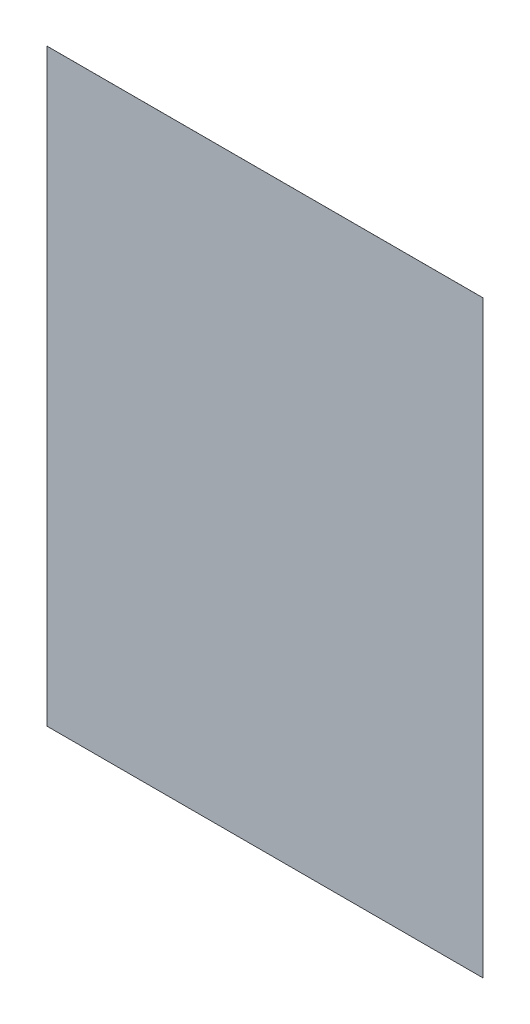
ISO-10303-21;
HEADER;
FILE_DESCRIPTION(('STEP AP214'),'2;1');
FILE_NAME('part.step','',(''),(''),'','','');
FILE_SCHEMA(('AUTOMOTIVE_DESIGN { 1 0 10303 214 1 1 1 1 }'));
ENDSEC;
DATA;
#1=APPLICATION_CONTEXT('core data for automotive mechanical design processes');
#2=APPLICATION_PROTOCOL_DEFINITION('international standard','automotive_design',2000,#1);
#3=PRODUCT_CONTEXT('',#1,'mechanical');
#4=PRODUCT('Part','Part','',(#3));
#5=PRODUCT_RELATED_PRODUCT_CATEGORY('part','',(#4));
#6=PRODUCT_DEFINITION_FORMATION('','',#4);
#7=PRODUCT_DEFINITION_CONTEXT('part definition',#1,'design');
#8=PRODUCT_DEFINITION('design','',#6,#7);
#9=PRODUCT_DEFINITION_SHAPE('','',#8);
#10=(LENGTH_UNIT() NAMED_UNIT(*) SI_UNIT(.MILLI.,.METRE.));
#11=(NAMED_UNIT(*) PLANE_ANGLE_UNIT() SI_UNIT($,.RADIAN.));
#12=(NAMED_UNIT(*) SI_UNIT($,.STERADIAN.) SOLID_ANGLE_UNIT());
#13=UNCERTAINTY_MEASURE_WITH_UNIT(LENGTH_MEASURE(1.E-05),#10,'distance_accuracy_value','');
#14=(GEOMETRIC_REPRESENTATION_CONTEXT(3) GLOBAL_UNCERTAINTY_ASSIGNED_CONTEXT((#13)) GLOBAL_UNIT_ASSIGNED_CONTEXT((#10,
#11,#12)) REPRESENTATION_CONTEXT('',''));
#15=CARTESIAN_POINT('',(0.,0.,0.));
#16=DIRECTION('',(0.,0.,1.));
#17=DIRECTION('',(1.,0.,0.));
#18=AXIS2_PLACEMENT_3D('',#15,#16,#17);
#19=CARTESIAN_POINT('',(0.,-135.,0.));
#20=DIRECTION('',(0.,1.,0.));
#21=DIRECTION('',(0.,0.,1.));
#22=AXIS2_PLACEMENT_3D('',#19,#20,#21);
#23=PLANE('',#22);
#24=DIRECTION('',(1.,0.,0.));
#25=VECTOR('',#24,1.);
#26=CARTESIAN_POINT('',(0.,-135.,0.));
#27=LINE('',#26,#25);
#28=CARTESIAN_POINT('',(-100.,-135.,0.));
#29=VERTEX_POINT('',#28);
#30=CARTESIAN_POINT('',(100.,-135.,0.));
#31=VERTEX_POINT('',#30);
#32=EDGE_CURVE('E79',#29,#31,#27,.T.);
#33=ORIENTED_EDGE('',*,*,#32,.T.);
#34=DIRECTION('',(0.,0.,-1.));
#35=VECTOR('',#34,1.);
#36=CARTESIAN_POINT('',(100.,-135.,0.));
#37=LINE('',#36,#35);
#38=CARTESIAN_POINT('',(100.,-135.,0.0125));
#39=VERTEX_POINT('',#38);
#40=EDGE_CURVE('E54',#31,#39,#37,.F.);
#41=ORIENTED_EDGE('',*,*,#40,.T.);
#42=DIRECTION('',(1.,0.,0.));
#43=VECTOR('',#42,1.);
#44=CARTESIAN_POINT('',(0.,-135.,0.0125));
#45=LINE('',#44,#43);
#46=CARTESIAN_POINT('',(-100.,-135.,0.0125));
#47=VERTEX_POINT('',#46);
#48=EDGE_CURVE('E77',#39,#47,#45,.F.);
#49=ORIENTED_EDGE('',*,*,#48,.T.);
#50=DIRECTION('',(0.,0.,1.));
#51=VECTOR('',#50,1.);
#52=CARTESIAN_POINT('',(-100.,-135.,0.));
#53=LINE('',#52,#51);
#54=EDGE_CURVE('E19',#29,#47,#53,.T.);
#55=ORIENTED_EDGE('',*,*,#54,.F.);
#56=EDGE_LOOP('',(#33,#41,#49,#55));
#57=FACE_BOUND('',#56,.T.);
#58=ADVANCED_FACE('F16',(#57),#23,.F.);
#59=CARTESIAN_POINT('',(100.,0.,0.));
#60=DIRECTION('',(1.,0.,0.));
#61=DIRECTION('',(0.,0.,-1.));
#62=AXIS2_PLACEMENT_3D('',#59,#60,#61);
#63=PLANE('',#62);
#64=DIRECTION('',(0.,1.,0.));
#65=VECTOR('',#64,1.);
#66=CARTESIAN_POINT('',(100.,0.,0.));
#67=LINE('',#66,#65);
#68=CARTESIAN_POINT('',(100.,135.,0.));
#69=VERTEX_POINT('',#68);
#70=EDGE_CURVE('E66',#31,#69,#67,.T.);
#71=ORIENTED_EDGE('',*,*,#70,.T.);
#72=DIRECTION('',(0.,0.,-1.));
#73=VECTOR('',#72,1.);
#74=CARTESIAN_POINT('',(100.,135.,0.));
#75=LINE('',#74,#73);
#76=CARTESIAN_POINT('',(100.,135.,0.0125));
#77=VERTEX_POINT('',#76);
#78=EDGE_CURVE('E59',#69,#77,#75,.F.);
#79=ORIENTED_EDGE('',*,*,#78,.T.);
#80=DIRECTION('',(0.,1.,0.));
#81=VECTOR('',#80,1.);
#82=CARTESIAN_POINT('',(100.,0.,0.0125));
#83=LINE('',#82,#81);
#84=EDGE_CURVE('E63',#77,#39,#83,.F.);
#85=ORIENTED_EDGE('',*,*,#84,.T.);
#86=ORIENTED_EDGE('',*,*,#40,.F.);
#87=EDGE_LOOP('',(#71,#79,#85,#86));
#88=FACE_BOUND('',#87,.T.);
#89=ADVANCED_FACE('F61',(#88),#63,.T.);
#90=CARTESIAN_POINT('',(0.,135.,0.));
#91=DIRECTION('',(0.,-1.,0.));
#92=DIRECTION('',(0.,0.,-1.));
#93=AXIS2_PLACEMENT_3D('',#90,#91,#92);
#94=PLANE('',#93);
#95=DIRECTION('',(1.,0.,0.));
#96=VECTOR('',#95,1.);
#97=CARTESIAN_POINT('',(0.,135.,0.));
#98=LINE('',#97,#96);
#99=CARTESIAN_POINT('',(-100.,135.,0.));
#100=VERTEX_POINT('',#99);
#101=EDGE_CURVE('E85',#69,#100,#98,.F.);
#102=ORIENTED_EDGE('',*,*,#101,.T.);
#103=DIRECTION('',(0.,0.,-1.));
#104=VECTOR('',#103,1.);
#105=CARTESIAN_POINT('',(-100.,135.,0.));
#106=LINE('',#105,#104);
#107=CARTESIAN_POINT('',(-100.,135.,0.0125));
#108=VERTEX_POINT('',#107);
#109=EDGE_CURVE('E34',#108,#100,#106,.T.);
#110=ORIENTED_EDGE('',*,*,#109,.F.);
#111=DIRECTION('',(1.,0.,0.));
#112=VECTOR('',#111,1.);
#113=CARTESIAN_POINT('',(0.,135.,0.0125));
#114=LINE('',#113,#112);
#115=EDGE_CURVE('E69',#108,#77,#114,.T.);
#116=ORIENTED_EDGE('',*,*,#115,.T.);
#117=ORIENTED_EDGE('',*,*,#78,.F.);
#118=EDGE_LOOP('',(#102,#110,#116,#117));
#119=FACE_BOUND('',#118,.T.);
#120=ADVANCED_FACE('F72',(#119),#94,.F.);
#121=CARTESIAN_POINT('',(0.,0.,0.0125));
#122=DIRECTION('',(0.,0.,1.));
#123=DIRECTION('',(1.,0.,0.));
#124=AXIS2_PLACEMENT_3D('',#121,#122,#123);
#125=PLANE('',#124);
#126=ORIENTED_EDGE('',*,*,#48,.F.);
#127=ORIENTED_EDGE('',*,*,#84,.F.);
#128=ORIENTED_EDGE('',*,*,#115,.F.);
#129=DIRECTION('',(0.,1.,0.));
#130=VECTOR('',#129,1.);
#131=CARTESIAN_POINT('',(-100.,0.,0.0125));
#132=LINE('',#131,#130);
#133=EDGE_CURVE('E25',#108,#47,#132,.F.);
#134=ORIENTED_EDGE('',*,*,#133,.T.);
#135=EDGE_LOOP('',(#126,#127,#128,#134));
#136=FACE_BOUND('',#135,.T.);
#137=ADVANCED_FACE('F76',(#136),#125,.T.);
#138=CARTESIAN_POINT('',(0.,0.,0.));
#139=DIRECTION('',(0.,0.,1.));
#140=DIRECTION('',(1.,0.,0.));
#141=AXIS2_PLACEMENT_3D('',#138,#139,#140);
#142=PLANE('',#141);
#143=ORIENTED_EDGE('',*,*,#70,.F.);
#144=ORIENTED_EDGE('',*,*,#32,.F.);
#145=DIRECTION('',(0.,1.,0.));
#146=VECTOR('',#145,1.);
#147=CARTESIAN_POINT('',(-100.,0.,0.));
#148=LINE('',#147,#146);
#149=EDGE_CURVE('E11',#29,#100,#148,.T.);
#150=ORIENTED_EDGE('',*,*,#149,.T.);
#151=ORIENTED_EDGE('',*,*,#101,.F.);
#152=EDGE_LOOP('',(#143,#144,#150,#151));
#153=FACE_BOUND('',#152,.T.);
#154=ADVANCED_FACE('F90',(#153),#142,.F.);
#155=CARTESIAN_POINT('',(-100.,0.,0.));
#156=DIRECTION('',(-1.,0.,0.));
#157=DIRECTION('',(0.,0.,1.));
#158=AXIS2_PLACEMENT_3D('',#155,#156,#157);
#159=PLANE('',#158);
#160=ORIENTED_EDGE('',*,*,#149,.F.);
#161=ORIENTED_EDGE('',*,*,#54,.T.);
#162=ORIENTED_EDGE('',*,*,#133,.F.);
#163=ORIENTED_EDGE('',*,*,#109,.T.);
#164=EDGE_LOOP('',(#160,#161,#162,#163));
#165=FACE_BOUND('',#164,.T.);
#166=ADVANCED_FACE('F83',(#165),#159,.T.);
#167=CLOSED_SHELL('',(#58,#89,#120,#137,#154,#166));
#168=MANIFOLD_SOLID_BREP('B1',#167);
#169=ADVANCED_BREP_SHAPE_REPRESENTATION('',(#18,#168),#14);
#170=SHAPE_DEFINITION_REPRESENTATION(#9,#169);
ENDSEC;
END-ISO-10303-21;
